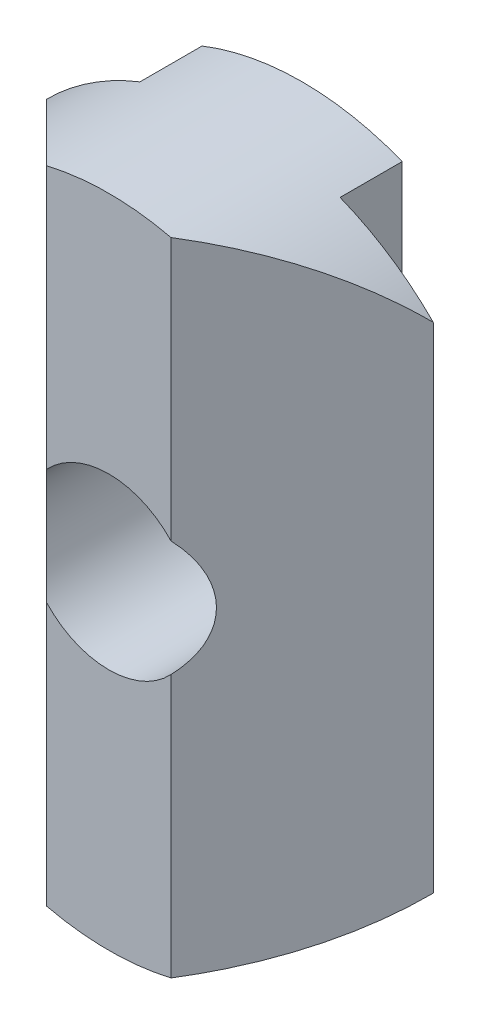
ISO-10303-21;
HEADER;
FILE_DESCRIPTION(('STEP AP214'),'2;1');
FILE_NAME('part.step','',(''),(''),'','','');
FILE_SCHEMA(('AUTOMOTIVE_DESIGN { 1 0 10303 214 1 1 1 1 }'));
ENDSEC;
DATA;
#1=APPLICATION_CONTEXT('core data for automotive mechanical design processes');
#2=APPLICATION_PROTOCOL_DEFINITION('international standard','automotive_design',2000,#1);
#3=PRODUCT_CONTEXT('',#1,'mechanical');
#4=PRODUCT('Part','Part','',(#3));
#5=PRODUCT_RELATED_PRODUCT_CATEGORY('part','',(#4));
#6=PRODUCT_DEFINITION_FORMATION('','',#4);
#7=PRODUCT_DEFINITION_CONTEXT('part definition',#1,'design');
#8=PRODUCT_DEFINITION('design','',#6,#7);
#9=PRODUCT_DEFINITION_SHAPE('','',#8);
#10=(LENGTH_UNIT() NAMED_UNIT(*) SI_UNIT(.MILLI.,.METRE.));
#11=(NAMED_UNIT(*) PLANE_ANGLE_UNIT() SI_UNIT($,.RADIAN.));
#12=(NAMED_UNIT(*) SI_UNIT($,.STERADIAN.) SOLID_ANGLE_UNIT());
#13=UNCERTAINTY_MEASURE_WITH_UNIT(LENGTH_MEASURE(1.E-05),#10,'distance_accuracy_value','');
#14=(GEOMETRIC_REPRESENTATION_CONTEXT(3) GLOBAL_UNCERTAINTY_ASSIGNED_CONTEXT((#13)) GLOBAL_UNIT_ASSIGNED_CONTEXT((#10,
#11,#12)) REPRESENTATION_CONTEXT('',''));
#15=CARTESIAN_POINT('',(0.,0.,0.));
#16=DIRECTION('',(0.,0.,1.));
#17=DIRECTION('',(1.,0.,0.));
#18=AXIS2_PLACEMENT_3D('',#15,#16,#17);
#19=CARTESIAN_POINT('',(0.9,4.75,0.));
#20=DIRECTION('',(0.,0.,-1.));
#21=DIRECTION('',(-1.,0.,0.));
#22=AXIS2_PLACEMENT_3D('',#19,#20,#21);
#23=PLANE('',#22);
#24=DIRECTION('',(0.,-1.,0.));
#25=VECTOR('',#24,1.);
#26=CARTESIAN_POINT('',(-0.9,4.75,0.));
#27=LINE('',#26,#25);
#28=CARTESIAN_POINT('',(-0.9,4.64581874184969,0.));
#29=VERTEX_POINT('',#28);
#30=CARTESIAN_POINT('',(-0.9,0.8374741134059,0.));
#31=VERTEX_POINT('',#30);
#32=EDGE_CURVE('E40',#29,#31,#27,.T.);
#33=ORIENTED_EDGE('',*,*,#32,.T.);
#34=CARTESIAN_POINT('',(0.,0.,0.));
#35=DIRECTION('',(0.,0.,-1.));
#36=DIRECTION('',(-1.,0.,0.));
#37=AXIS2_PLACEMENT_3D('',#34,#35,#36);
#38=CIRCLE('',#37,1.229375);
#39=CARTESIAN_POINT('',(0.9,0.8374741134059,0.));
#40=VERTEX_POINT('',#39);
#41=EDGE_CURVE('E46',#31,#40,#38,.T.);
#42=ORIENTED_EDGE('',*,*,#41,.T.);
#43=DIRECTION('',(0.,-1.,0.));
#44=VECTOR('',#43,1.);
#45=CARTESIAN_POINT('',(0.9,4.75,0.));
#46=LINE('',#45,#44);
#47=CARTESIAN_POINT('',(0.9,4.64581874184969,0.));
#48=VERTEX_POINT('',#47);
#49=EDGE_CURVE('E129',#48,#40,#46,.T.);
#50=ORIENTED_EDGE('',*,*,#49,.F.);
#51=CARTESIAN_POINT('',(0.,0.810453918854162,0.));
#52=DIRECTION('',(0.,0.,1.));
#53=DIRECTION('',(-1.,0.,0.));
#54=AXIS2_PLACEMENT_3D('',#51,#52,#53);
#55=CIRCLE('',#54,3.93954608114584);
#56=EDGE_CURVE('E126',#48,#29,#55,.T.);
#57=ORIENTED_EDGE('',*,*,#56,.T.);
#58=EDGE_LOOP('',(#33,#42,#50,#57));
#59=FACE_BOUND('',#58,.T.);
#60=ADVANCED_FACE('F36',(#59),#23,.F.);
#61=CARTESIAN_POINT('',(-0.9,4.75,0.));
#62=DIRECTION('',(0.707106781186547,0.,-0.707106781186548));
#63=DIRECTION('',(-0.707106781186548,0.,-0.707106781186547));
#64=AXIS2_PLACEMENT_3D('',#61,#62,#63);
#65=PLANE('',#64);
#66=CARTESIAN_POINT('',(-0.9,-0.8374741134059,0.));
#67=VERTEX_POINT('',#66);
#68=CARTESIAN_POINT('',(-0.9,-4.64581874184969,0.));
#69=VERTEX_POINT('',#68);
#70=EDGE_CURVE('E125',#67,#69,#27,.T.);
#71=ORIENTED_EDGE('',*,*,#70,.F.);
#72=CARTESIAN_POINT('',(0.,0.,0.899999999999999));
#73=DIRECTION('',(0.707106781186547,0.,-0.707106781186548));
#74=DIRECTION('',(-0.707106781186548,0.,-0.707106781186547));
#75=AXIS2_PLACEMENT_3D('',#72,#73,#74);
#76=ELLIPSE('',#75,1.73859879824242,1.229375);
#77=EDGE_CURVE('E53',#67,#31,#76,.T.);
#78=ORIENTED_EDGE('',*,*,#77,.T.);
#79=ORIENTED_EDGE('',*,*,#32,.F.);
#80=CARTESIAN_POINT('',(0.,0.810453918854162,0.899999999999999));
#81=DIRECTION('',(0.707106781186547,0.,-0.707106781186548));
#82=DIRECTION('',(0.707106781186548,0.,0.707106781186547));
#83=AXIS2_PLACEMENT_3D('',#80,#81,#82);
#84=ELLIPSE('',#83,5.57135949755022,3.93954608114584);
#85=CARTESIAN_POINT('',(-2.8,3.58173941938844,-1.9));
#86=VERTEX_POINT('',#85);
#87=EDGE_CURVE('E161',#86,#29,#84,.T.);
#88=ORIENTED_EDGE('',*,*,#87,.F.);
#89=DIRECTION('',(0.,-1.,0.));
#90=VECTOR('',#89,1.);
#91=CARTESIAN_POINT('',(-2.8,4.75,-1.9));
#92=LINE('',#91,#90);
#93=CARTESIAN_POINT('',(-2.8,-3.58173941938844,-1.9));
#94=VERTEX_POINT('',#93);
#95=EDGE_CURVE('E152',#86,#94,#92,.T.);
#96=ORIENTED_EDGE('',*,*,#95,.T.);
#97=CARTESIAN_POINT('',(0.,-0.810453918854162,0.899999999999999));
#98=DIRECTION('',(0.707106781186547,0.,-0.707106781186548));
#99=DIRECTION('',(0.707106781186548,0.,0.707106781186547));
#100=AXIS2_PLACEMENT_3D('',#97,#98,#99);
#101=ELLIPSE('',#100,5.57135949755022,3.93954608114584);
#102=EDGE_CURVE('E173',#69,#94,#101,.T.);
#103=ORIENTED_EDGE('',*,*,#102,.F.);
#104=EDGE_LOOP('',(#71,#78,#79,#88,#96,#103));
#105=FACE_BOUND('',#104,.T.);
#106=ADVANCED_FACE('F38',(#105),#65,.F.);
#107=CARTESIAN_POINT('',(0.9,-0.8374741134059,0.));
#108=VERTEX_POINT('',#107);
#109=CARTESIAN_POINT('',(0.9,-4.64581874184969,0.));
#110=VERTEX_POINT('',#109);
#111=EDGE_CURVE('E133',#108,#110,#46,.T.);
#112=ORIENTED_EDGE('',*,*,#111,.F.);
#113=EDGE_CURVE('E12',#108,#67,#38,.T.);
#114=ORIENTED_EDGE('',*,*,#113,.T.);
#115=ORIENTED_EDGE('',*,*,#70,.T.);
#116=CARTESIAN_POINT('',(0.,-0.810453918854162,0.));
#117=DIRECTION('',(0.,0.,1.));
#118=DIRECTION('',(1.,0.,0.));
#119=AXIS2_PLACEMENT_3D('',#116,#117,#118);
#120=CIRCLE('',#119,3.93954608114584);
#121=EDGE_CURVE('E181',#69,#110,#120,.T.);
#122=ORIENTED_EDGE('',*,*,#121,.T.);
#123=EDGE_LOOP('',(#112,#114,#115,#122));
#124=FACE_BOUND('',#123,.T.);
#125=ADVANCED_FACE('F215',(#124),#23,.F.);
#126=CARTESIAN_POINT('',(0.9,4.75,0.));
#127=DIRECTION('',(-0.707106781186547,0.,-0.707106781186548));
#128=DIRECTION('',(-0.707106781186548,0.,0.707106781186547));
#129=AXIS2_PLACEMENT_3D('',#126,#127,#128);
#130=PLANE('',#129);
#131=ORIENTED_EDGE('',*,*,#49,.T.);
#132=CARTESIAN_POINT('',(0.,0.,0.899999999999999));
#133=DIRECTION('',(-0.707106781186547,0.,-0.707106781186548));
#134=DIRECTION('',(0.707106781186548,0.,-0.707106781186547));
#135=AXIS2_PLACEMENT_3D('',#132,#133,#134);
#136=ELLIPSE('',#135,1.73859879824242,1.229375);
#137=EDGE_CURVE('E114',#40,#108,#136,.T.);
#138=ORIENTED_EDGE('',*,*,#137,.T.);
#139=ORIENTED_EDGE('',*,*,#111,.T.);
#140=CARTESIAN_POINT('',(0.,-0.810453918854162,0.899999999999999));
#141=DIRECTION('',(-0.707106781186547,0.,-0.707106781186548));
#142=DIRECTION('',(-0.707106781186548,0.,0.707106781186547));
#143=AXIS2_PLACEMENT_3D('',#140,#141,#142);
#144=ELLIPSE('',#143,5.57135949755022,3.93954608114584);
#145=CARTESIAN_POINT('',(2.8,-3.58173941938844,-1.9));
#146=VERTEX_POINT('',#145);
#147=EDGE_CURVE('E166',#146,#110,#144,.T.);
#148=ORIENTED_EDGE('',*,*,#147,.F.);
#149=DIRECTION('',(0.,-1.,0.));
#150=VECTOR('',#149,1.);
#151=CARTESIAN_POINT('',(2.8,4.75,-1.9));
#152=LINE('',#151,#150);
#153=CARTESIAN_POINT('',(2.8,3.58173941938844,-1.9));
#154=VERTEX_POINT('',#153);
#155=EDGE_CURVE('E136',#154,#146,#152,.T.);
#156=ORIENTED_EDGE('',*,*,#155,.F.);
#157=CARTESIAN_POINT('',(0.,0.810453918854162,0.899999999999999));
#158=DIRECTION('',(-0.707106781186547,0.,-0.707106781186548));
#159=DIRECTION('',(-0.707106781186548,0.,0.707106781186547));
#160=AXIS2_PLACEMENT_3D('',#157,#158,#159);
#161=ELLIPSE('',#160,5.57135949755022,3.93954608114584);
#162=EDGE_CURVE('E155',#48,#154,#161,.T.);
#163=ORIENTED_EDGE('',*,*,#162,.F.);
#164=EDGE_LOOP('',(#131,#138,#139,#148,#156,#163));
#165=FACE_BOUND('',#164,.T.);
#166=ADVANCED_FACE('F213',(#165),#130,.F.);
#167=CARTESIAN_POINT('',(2.8,4.75,-1.9));
#168=DIRECTION('',(0.,0.,1.));
#169=DIRECTION('',(1.,0.,0.));
#170=AXIS2_PLACEMENT_3D('',#167,#168,#169);
#171=PLANE('',#170);
#172=CARTESIAN_POINT('',(0.,0.810453918854162,-1.9));
#173=DIRECTION('',(0.,0.,1.));
#174=DIRECTION('',(1.,0.,0.));
#175=AXIS2_PLACEMENT_3D('',#172,#173,#174);
#176=CIRCLE('',#175,3.93954608114584);
#177=CARTESIAN_POINT('',(1.45,4.47344768426948,-1.9));
#178=VERTEX_POINT('',#177);
#179=EDGE_CURVE('E157',#154,#178,#176,.T.);
#180=ORIENTED_EDGE('',*,*,#179,.F.);
#181=ORIENTED_EDGE('',*,*,#155,.T.);
#182=CARTESIAN_POINT('',(0.,-0.810453918854162,-1.9));
#183=DIRECTION('',(0.,0.,1.));
#184=DIRECTION('',(1.,0.,0.));
#185=AXIS2_PLACEMENT_3D('',#182,#183,#184);
#186=CIRCLE('',#185,3.93954608114584);
#187=CARTESIAN_POINT('',(1.45,-4.47344768426948,-1.9));
#188=VERTEX_POINT('',#187);
#189=EDGE_CURVE('E169',#188,#146,#186,.T.);
#190=ORIENTED_EDGE('',*,*,#189,.F.);
#191=DIRECTION('',(0.,-1.,0.));
#192=VECTOR('',#191,1.);
#193=CARTESIAN_POINT('',(1.45,4.75,-1.9));
#194=LINE('',#193,#192);
#195=EDGE_CURVE('E140',#178,#188,#194,.T.);
#196=ORIENTED_EDGE('',*,*,#195,.F.);
#197=EDGE_LOOP('',(#180,#181,#190,#196));
#198=FACE_BOUND('',#197,.T.);
#199=ADVANCED_FACE('F211',(#198),#171,.F.);
#200=CARTESIAN_POINT('',(1.45,4.75,-1.9));
#201=DIRECTION('',(-1.,0.,0.));
#202=DIRECTION('',(0.,0.,1.));
#203=AXIS2_PLACEMENT_3D('',#200,#201,#202);
#204=PLANE('',#203);
#205=DIRECTION('',(0.,0.,1.));
#206=VECTOR('',#205,1.);
#207=CARTESIAN_POINT('',(1.45,4.47344768426948,-2.8));
#208=LINE('',#207,#206);
#209=CARTESIAN_POINT('',(1.45,4.47344768426948,-2.8));
#210=VERTEX_POINT('',#209);
#211=EDGE_CURVE('E159',#178,#210,#208,.F.);
#212=ORIENTED_EDGE('',*,*,#211,.F.);
#213=ORIENTED_EDGE('',*,*,#195,.T.);
#214=DIRECTION('',(0.,0.,1.));
#215=VECTOR('',#214,1.);
#216=CARTESIAN_POINT('',(1.45,-4.47344768426948,-2.8));
#217=LINE('',#216,#215);
#218=CARTESIAN_POINT('',(1.45,-4.47344768426948,-2.8));
#219=VERTEX_POINT('',#218);
#220=EDGE_CURVE('E171',#219,#188,#217,.T.);
#221=ORIENTED_EDGE('',*,*,#220,.F.);
#222=DIRECTION('',(0.,-1.,0.));
#223=VECTOR('',#222,1.);
#224=CARTESIAN_POINT('',(1.45,4.75,-2.8));
#225=LINE('',#224,#223);
#226=EDGE_CURVE('E143',#210,#219,#225,.T.);
#227=ORIENTED_EDGE('',*,*,#226,.F.);
#228=EDGE_LOOP('',(#212,#213,#221,#227));
#229=FACE_BOUND('',#228,.T.);
#230=ADVANCED_FACE('F196',(#229),#204,.F.);
#231=CARTESIAN_POINT('',(1.45,4.75,-2.8));
#232=DIRECTION('',(0.,0.,1.));
#233=DIRECTION('',(1.,0.,0.));
#234=AXIS2_PLACEMENT_3D('',#231,#232,#233);
#235=PLANE('',#234);
#236=CARTESIAN_POINT('',(0.,0.,-2.8));
#237=DIRECTION('',(0.,0.,-1.));
#238=DIRECTION('',(-1.,0.,0.));
#239=AXIS2_PLACEMENT_3D('',#236,#237,#238);
#240=CIRCLE('',#239,1.229375);
#241=CARTESIAN_POINT('',(-1.229375,0.,-2.8));
#242=VERTEX_POINT('',#241);
#243=EDGE_CURVE('E119',#242,#242,#240,.T.);
#244=ORIENTED_EDGE('',*,*,#243,.F.);
#245=EDGE_LOOP('',(#244));
#246=FACE_BOUND('',#245,.T.);
#247=CARTESIAN_POINT('',(0.,0.810453918854162,-2.8));
#248=DIRECTION('',(0.,0.,1.));
#249=DIRECTION('',(-1.,0.,0.));
#250=AXIS2_PLACEMENT_3D('',#247,#248,#249);
#251=CIRCLE('',#250,3.93954608114584);
#252=CARTESIAN_POINT('',(-1.45,4.47344768426948,-2.8));
#253=VERTEX_POINT('',#252);
#254=EDGE_CURVE('E183',#210,#253,#251,.T.);
#255=ORIENTED_EDGE('',*,*,#254,.F.);
#256=ORIENTED_EDGE('',*,*,#226,.T.);
#257=CARTESIAN_POINT('',(0.,-0.810453918854162,-2.8));
#258=DIRECTION('',(0.,0.,1.));
#259=DIRECTION('',(1.,0.,0.));
#260=AXIS2_PLACEMENT_3D('',#257,#258,#259);
#261=CIRCLE('',#260,3.93954608114584);
#262=CARTESIAN_POINT('',(-1.45,-4.47344768426948,-2.8));
#263=VERTEX_POINT('',#262);
#264=EDGE_CURVE('E180',#263,#219,#261,.T.);
#265=ORIENTED_EDGE('',*,*,#264,.F.);
#266=DIRECTION('',(0.,-1.,0.));
#267=VECTOR('',#266,1.);
#268=CARTESIAN_POINT('',(-1.45,4.75,-2.8));
#269=LINE('',#268,#267);
#270=EDGE_CURVE('E146',#253,#263,#269,.T.);
#271=ORIENTED_EDGE('',*,*,#270,.F.);
#272=EDGE_LOOP('',(#255,#256,#265,#271));
#273=FACE_BOUND('',#272,.T.);
#274=ADVANCED_FACE('F192',(#246,#273),#235,.F.);
#275=CARTESIAN_POINT('',(-1.45,4.75,-1.9));
#276=DIRECTION('',(1.,0.,0.));
#277=DIRECTION('',(0.,0.,-1.));
#278=AXIS2_PLACEMENT_3D('',#275,#276,#277);
#279=PLANE('',#278);
#280=DIRECTION('',(0.,0.,1.));
#281=VECTOR('',#280,1.);
#282=CARTESIAN_POINT('',(-1.45,4.47344768426948,-2.8));
#283=LINE('',#282,#281);
#284=CARTESIAN_POINT('',(-1.45,4.47344768426948,-1.9));
#285=VERTEX_POINT('',#284);
#286=EDGE_CURVE('E60',#253,#285,#283,.T.);
#287=ORIENTED_EDGE('',*,*,#286,.F.);
#288=ORIENTED_EDGE('',*,*,#270,.T.);
#289=DIRECTION('',(0.,0.,1.));
#290=VECTOR('',#289,1.);
#291=CARTESIAN_POINT('',(-1.45,-4.47344768426948,-2.8));
#292=LINE('',#291,#290);
#293=CARTESIAN_POINT('',(-1.45,-4.47344768426948,-1.9));
#294=VERTEX_POINT('',#293);
#295=EDGE_CURVE('E175',#294,#263,#292,.F.);
#296=ORIENTED_EDGE('',*,*,#295,.F.);
#297=DIRECTION('',(0.,-1.,0.));
#298=VECTOR('',#297,1.);
#299=CARTESIAN_POINT('',(-1.45,4.75,-1.9));
#300=LINE('',#299,#298);
#301=EDGE_CURVE('E149',#285,#294,#300,.T.);
#302=ORIENTED_EDGE('',*,*,#301,.F.);
#303=EDGE_LOOP('',(#287,#288,#296,#302));
#304=FACE_BOUND('',#303,.T.);
#305=ADVANCED_FACE('F195',(#304),#279,.F.);
#306=CARTESIAN_POINT('',(-2.8,4.75,-1.9));
#307=DIRECTION('',(0.,0.,1.));
#308=DIRECTION('',(1.,0.,0.));
#309=AXIS2_PLACEMENT_3D('',#306,#307,#308);
#310=PLANE('',#309);
#311=CARTESIAN_POINT('',(0.,0.810453918854162,-1.9));
#312=DIRECTION('',(0.,0.,1.));
#313=DIRECTION('',(1.,0.,0.));
#314=AXIS2_PLACEMENT_3D('',#311,#312,#313);
#315=CIRCLE('',#314,3.93954608114584);
#316=EDGE_CURVE('E164',#285,#86,#315,.T.);
#317=ORIENTED_EDGE('',*,*,#316,.F.);
#318=ORIENTED_EDGE('',*,*,#301,.T.);
#319=CARTESIAN_POINT('',(0.,-0.810453918854162,-1.9));
#320=DIRECTION('',(0.,0.,1.));
#321=DIRECTION('',(1.,0.,0.));
#322=AXIS2_PLACEMENT_3D('',#319,#320,#321);
#323=CIRCLE('',#322,3.93954608114584);
#324=EDGE_CURVE('E178',#94,#294,#323,.T.);
#325=ORIENTED_EDGE('',*,*,#324,.F.);
#326=ORIENTED_EDGE('',*,*,#95,.F.);
#327=EDGE_LOOP('',(#317,#318,#325,#326));
#328=FACE_BOUND('',#327,.T.);
#329=ADVANCED_FACE('F287',(#328),#310,.F.);
#330=CARTESIAN_POINT('',(0.,-0.810453918854162,-2.8));
#331=DIRECTION('',(0.,0.,1.));
#332=DIRECTION('',(1.,0.,0.));
#333=AXIS2_PLACEMENT_3D('',#330,#331,#332);
#334=CYLINDRICAL_SURFACE('',#333,3.93954608114584);
#335=ORIENTED_EDGE('',*,*,#147,.T.);
#336=ORIENTED_EDGE('',*,*,#121,.F.);
#337=ORIENTED_EDGE('',*,*,#102,.T.);
#338=ORIENTED_EDGE('',*,*,#324,.T.);
#339=ORIENTED_EDGE('',*,*,#295,.T.);
#340=ORIENTED_EDGE('',*,*,#264,.T.);
#341=ORIENTED_EDGE('',*,*,#220,.T.);
#342=ORIENTED_EDGE('',*,*,#189,.T.);
#343=EDGE_LOOP('',(#335,#336,#337,#338,#339,#340,#341,#342));
#344=FACE_BOUND('',#343,.T.);
#345=ADVANCED_FACE('F207',(#344),#334,.T.);
#346=CARTESIAN_POINT('',(0.,0.810453918854162,-2.8));
#347=DIRECTION('',(0.,0.,1.));
#348=DIRECTION('',(1.,0.,0.));
#349=AXIS2_PLACEMENT_3D('',#346,#347,#348);
#350=CYLINDRICAL_SURFACE('',#349,3.93954608114584);
#351=ORIENTED_EDGE('',*,*,#162,.T.);
#352=ORIENTED_EDGE('',*,*,#179,.T.);
#353=ORIENTED_EDGE('',*,*,#211,.T.);
#354=ORIENTED_EDGE('',*,*,#254,.T.);
#355=ORIENTED_EDGE('',*,*,#286,.T.);
#356=ORIENTED_EDGE('',*,*,#316,.T.);
#357=ORIENTED_EDGE('',*,*,#87,.T.);
#358=ORIENTED_EDGE('',*,*,#56,.F.);
#359=EDGE_LOOP('',(#351,#352,#353,#354,#355,#356,#357,#358));
#360=FACE_BOUND('',#359,.T.);
#361=ADVANCED_FACE('F262',(#360),#350,.T.);
#362=CARTESIAN_POINT('',(0.,0.,-2.8));
#363=DIRECTION('',(0.,0.,-1.));
#364=DIRECTION('',(-1.,0.,0.));
#365=AXIS2_PLACEMENT_3D('',#362,#363,#364);
#366=CYLINDRICAL_SURFACE('',#365,1.229375);
#367=ORIENTED_EDGE('',*,*,#243,.T.);
#368=EDGE_LOOP('',(#367));
#369=FACE_BOUND('',#368,.T.);
#370=ORIENTED_EDGE('',*,*,#113,.F.);
#371=ORIENTED_EDGE('',*,*,#137,.F.);
#372=ORIENTED_EDGE('',*,*,#41,.F.);
#373=ORIENTED_EDGE('',*,*,#77,.F.);
#374=EDGE_LOOP('',(#370,#371,#372,#373));
#375=FACE_BOUND('',#374,.T.);
#376=ADVANCED_FACE('F112',(#369,#375),#366,.F.);
#377=CLOSED_SHELL('',(#60,#106,#125,#166,#199,#230,#274,#305,#329,#345,#361,#376));
#378=MANIFOLD_SOLID_BREP('B2',#377);
#379=ADVANCED_BREP_SHAPE_REPRESENTATION('',(#18,#378),#14);
#380=SHAPE_DEFINITION_REPRESENTATION(#9,#379);
ENDSEC;
END-ISO-10303-21;
